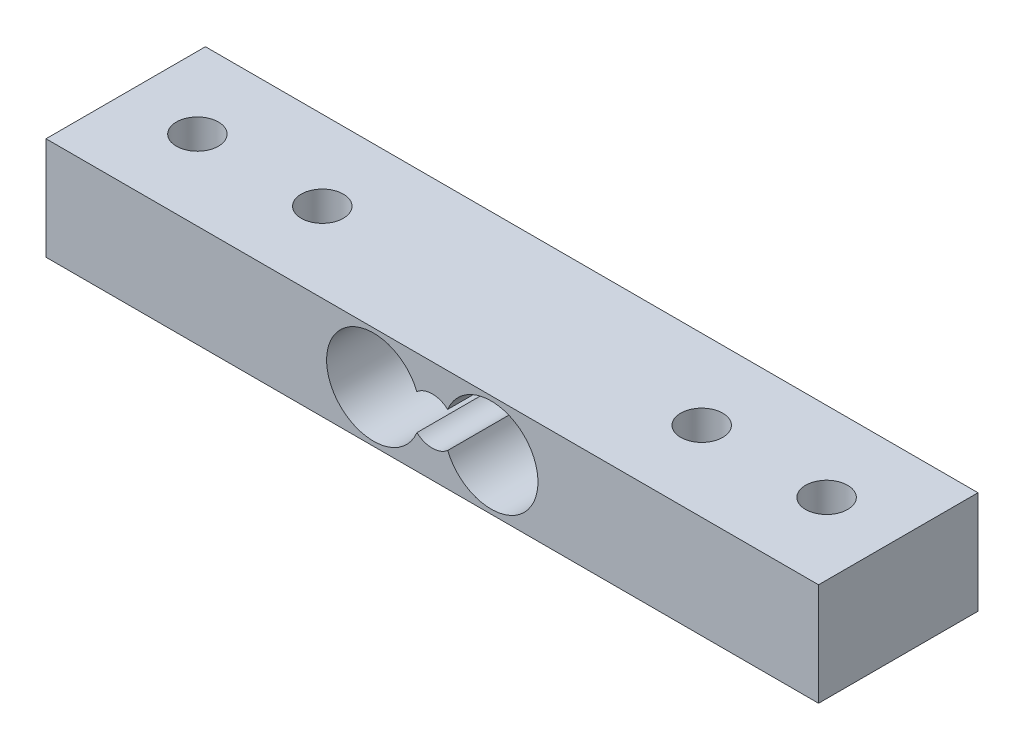
ISO-10303-21;
HEADER;
FILE_DESCRIPTION(('STEP AP214'),'2;1');
FILE_NAME('part.step','',(''),(''),'','','');
FILE_SCHEMA(('AUTOMOTIVE_DESIGN { 1 0 10303 214 1 1 1 1 }'));
ENDSEC;
DATA;
#1=APPLICATION_CONTEXT('core data for automotive mechanical design processes');
#2=APPLICATION_PROTOCOL_DEFINITION('international standard','automotive_design',2000,#1);
#3=PRODUCT_CONTEXT('',#1,'mechanical');
#4=PRODUCT('Part','Part','',(#3));
#5=PRODUCT_RELATED_PRODUCT_CATEGORY('part','',(#4));
#6=PRODUCT_DEFINITION_FORMATION('','',#4);
#7=PRODUCT_DEFINITION_CONTEXT('part definition',#1,'design');
#8=PRODUCT_DEFINITION('design','',#6,#7);
#9=PRODUCT_DEFINITION_SHAPE('','',#8);
#10=(LENGTH_UNIT() NAMED_UNIT(*) SI_UNIT(.MILLI.,.METRE.));
#11=(NAMED_UNIT(*) PLANE_ANGLE_UNIT() SI_UNIT($,.RADIAN.));
#12=(NAMED_UNIT(*) SI_UNIT($,.STERADIAN.) SOLID_ANGLE_UNIT());
#13=UNCERTAINTY_MEASURE_WITH_UNIT(LENGTH_MEASURE(1.E-05),#10,'distance_accuracy_value','');
#14=(GEOMETRIC_REPRESENTATION_CONTEXT(3) GLOBAL_UNCERTAINTY_ASSIGNED_CONTEXT((#13)) GLOBAL_UNIT_ASSIGNED_CONTEXT((#10,
#11,#12)) REPRESENTATION_CONTEXT('',''));
#15=CARTESIAN_POINT('',(0.,0.,0.));
#16=DIRECTION('',(0.,0.,1.));
#17=DIRECTION('',(1.,0.,0.));
#18=AXIS2_PLACEMENT_3D('',#15,#16,#17);
#19=CARTESIAN_POINT('',(-22.58,3.,0.));
#20=DIRECTION('',(0.,0.,1.));
#21=DIRECTION('',(1.,0.,0.));
#22=AXIS2_PLACEMENT_3D('',#19,#20,#21);
#23=CYLINDRICAL_SURFACE('',#22,1.375);
#24=DIRECTION('',(0.,0.,1.));
#25=VECTOR('',#24,1.);
#26=CARTESIAN_POINT('',(-23.4811084663068,4.03857042705353,0.));
#27=LINE('',#26,#25);
#28=CARTESIAN_POINT('',(-23.4811084663068,4.03857042705354,9.32));
#29=VERTEX_POINT('',#28);
#30=CARTESIAN_POINT('',(-23.4811084663068,4.03857042705354,0.));
#31=VERTEX_POINT('',#30);
#32=EDGE_CURVE('E94',#29,#31,#27,.F.);
#33=ORIENTED_EDGE('',*,*,#32,.T.);
#34=CARTESIAN_POINT('',(-22.58,3.,0.));
#35=DIRECTION('',(0.,0.,1.));
#36=DIRECTION('',(1.,0.,0.));
#37=AXIS2_PLACEMENT_3D('',#34,#35,#36);
#38=CIRCLE('',#37,1.375);
#39=CARTESIAN_POINT('',(-21.6788915336932,4.03857042705354,0.));
#40=VERTEX_POINT('',#39);
#41=EDGE_CURVE('E148',#31,#40,#38,.F.);
#42=ORIENTED_EDGE('',*,*,#41,.T.);
#43=DIRECTION('',(0.,0.,1.));
#44=VECTOR('',#43,1.);
#45=CARTESIAN_POINT('',(-21.6788915336932,4.03857042705353,0.));
#46=LINE('',#45,#44);
#47=CARTESIAN_POINT('',(-21.6788915336932,4.03857042705354,9.32));
#48=VERTEX_POINT('',#47);
#49=EDGE_CURVE('E154',#40,#48,#46,.T.);
#50=ORIENTED_EDGE('',*,*,#49,.T.);
#51=CARTESIAN_POINT('',(-22.58,3.,9.32));
#52=DIRECTION('',(0.,0.,1.));
#53=DIRECTION('',(1.,0.,0.));
#54=AXIS2_PLACEMENT_3D('',#51,#52,#53);
#55=CIRCLE('',#54,1.375);
#56=EDGE_CURVE('E102',#29,#48,#55,.F.);
#57=ORIENTED_EDGE('',*,*,#56,.F.);
#58=EDGE_LOOP('',(#33,#42,#50,#57));
#59=FACE_BOUND('',#58,.T.);
#60=ADVANCED_FACE('F16',(#59),#23,.F.);
#61=CARTESIAN_POINT('',(-19.143211517334,3.,0.));
#62=DIRECTION('',(0.,0.,1.));
#63=DIRECTION('',(1.,0.,0.));
#64=AXIS2_PLACEMENT_3D('',#61,#62,#63);
#65=CYLINDRICAL_SURFACE('',#64,2.74012804031372);
#66=ORIENTED_EDGE('',*,*,#49,.F.);
#67=CARTESIAN_POINT('',(-19.143211517334,3.,0.));
#68=DIRECTION('',(0.,0.,1.));
#69=DIRECTION('',(1.,0.,0.));
#70=AXIS2_PLACEMENT_3D('',#67,#68,#69);
#71=CIRCLE('',#70,2.74012804031372);
#72=CARTESIAN_POINT('',(-21.6788915336932,1.96142957294645,0.));
#73=VERTEX_POINT('',#72);
#74=EDGE_CURVE('E146',#40,#73,#71,.F.);
#75=ORIENTED_EDGE('',*,*,#74,.T.);
#76=DIRECTION('',(0.,0.,1.));
#77=VECTOR('',#76,1.);
#78=CARTESIAN_POINT('',(-21.6788915336932,1.96142957294645,0.));
#79=LINE('',#78,#77);
#80=CARTESIAN_POINT('',(-21.6788915336932,1.96142957294645,9.32));
#81=VERTEX_POINT('',#80);
#82=EDGE_CURVE('E78',#73,#81,#79,.T.);
#83=ORIENTED_EDGE('',*,*,#82,.T.);
#84=CARTESIAN_POINT('',(-19.143211517334,3.,9.32));
#85=DIRECTION('',(0.,0.,1.));
#86=DIRECTION('',(1.,0.,0.));
#87=AXIS2_PLACEMENT_3D('',#84,#85,#86);
#88=CIRCLE('',#87,2.74012804031372);
#89=EDGE_CURVE('E105',#48,#81,#88,.F.);
#90=ORIENTED_EDGE('',*,*,#89,.F.);
#91=EDGE_LOOP('',(#66,#75,#83,#90));
#92=FACE_BOUND('',#91,.T.);
#93=ADVANCED_FACE('F158',(#92),#65,.F.);
#94=CARTESIAN_POINT('',(-22.58,3.,0.));
#95=DIRECTION('',(0.,0.,1.));
#96=DIRECTION('',(1.,0.,0.));
#97=AXIS2_PLACEMENT_3D('',#94,#95,#96);
#98=CYLINDRICAL_SURFACE('',#97,1.375);
#99=ORIENTED_EDGE('',*,*,#82,.F.);
#100=CARTESIAN_POINT('',(-22.58,3.,0.));
#101=DIRECTION('',(0.,0.,1.));
#102=DIRECTION('',(1.,0.,0.));
#103=AXIS2_PLACEMENT_3D('',#100,#101,#102);
#104=CIRCLE('',#103,1.375);
#105=CARTESIAN_POINT('',(-23.4811084663068,1.96142957294646,0.));
#106=VERTEX_POINT('',#105);
#107=EDGE_CURVE('E90',#73,#106,#104,.F.);
#108=ORIENTED_EDGE('',*,*,#107,.T.);
#109=DIRECTION('',(0.,0.,1.));
#110=VECTOR('',#109,1.);
#111=CARTESIAN_POINT('',(-23.4811084663068,1.96142957294646,0.));
#112=LINE('',#111,#110);
#113=CARTESIAN_POINT('',(-23.4811084663068,1.96142957294646,9.32));
#114=VERTEX_POINT('',#113);
#115=EDGE_CURVE('E83',#106,#114,#112,.T.);
#116=ORIENTED_EDGE('',*,*,#115,.T.);
#117=CARTESIAN_POINT('',(-22.58,3.,9.32));
#118=DIRECTION('',(0.,0.,1.));
#119=DIRECTION('',(1.,0.,0.));
#120=AXIS2_PLACEMENT_3D('',#117,#118,#119);
#121=CIRCLE('',#120,1.375);
#122=EDGE_CURVE('E87',#81,#114,#121,.F.);
#123=ORIENTED_EDGE('',*,*,#122,.F.);
#124=EDGE_LOOP('',(#99,#108,#116,#123));
#125=FACE_BOUND('',#124,.T.);
#126=ADVANCED_FACE('F85',(#125),#98,.F.);
#127=CARTESIAN_POINT('',(-26.016788482666,3.,0.));
#128=DIRECTION('',(0.,0.,1.));
#129=DIRECTION('',(1.,0.,0.));
#130=AXIS2_PLACEMENT_3D('',#127,#128,#129);
#131=CYLINDRICAL_SURFACE('',#130,2.74012804031372);
#132=ORIENTED_EDGE('',*,*,#115,.F.);
#133=CARTESIAN_POINT('',(-26.016788482666,3.,0.));
#134=DIRECTION('',(0.,0.,1.));
#135=DIRECTION('',(1.,0.,0.));
#136=AXIS2_PLACEMENT_3D('',#133,#134,#135);
#137=CIRCLE('',#136,2.74012804031372);
#138=EDGE_CURVE('E142',#106,#31,#137,.F.);
#139=ORIENTED_EDGE('',*,*,#138,.T.);
#140=ORIENTED_EDGE('',*,*,#32,.F.);
#141=CARTESIAN_POINT('',(-26.016788482666,3.,9.32));
#142=DIRECTION('',(0.,0.,1.));
#143=DIRECTION('',(1.,0.,0.));
#144=AXIS2_PLACEMENT_3D('',#141,#142,#143);
#145=CIRCLE('',#144,2.74012804031372);
#146=EDGE_CURVE('E97',#114,#29,#145,.F.);
#147=ORIENTED_EDGE('',*,*,#146,.F.);
#148=EDGE_LOOP('',(#132,#139,#140,#147));
#149=FACE_BOUND('',#148,.T.);
#150=ADVANCED_FACE('F98',(#149),#131,.F.);
#151=CARTESIAN_POINT('',(-22.58,6.,0.));
#152=DIRECTION('',(0.,1.,0.));
#153=DIRECTION('',(0.,0.,1.));
#154=AXIS2_PLACEMENT_3D('',#151,#152,#153);
#155=PLANE('',#154);
#156=DIRECTION('',(1.,0.,0.));
#157=VECTOR('',#156,1.);
#158=CARTESIAN_POINT('',(-22.58,6.,0.));
#159=LINE('',#158,#157);
#160=CARTESIAN_POINT('',(0.,6.,0.));
#161=VERTEX_POINT('',#160);
#162=CARTESIAN_POINT('',(-45.16,6.,0.));
#163=VERTEX_POINT('',#162);
#164=EDGE_CURVE('E144',#161,#163,#159,.F.);
#165=ORIENTED_EDGE('',*,*,#164,.T.);
#166=DIRECTION('',(0.,0.,1.));
#167=VECTOR('',#166,1.);
#168=CARTESIAN_POINT('',(-45.16,6.,0.));
#169=LINE('',#168,#167);
#170=CARTESIAN_POINT('',(-45.16,6.,9.32));
#171=VERTEX_POINT('',#170);
#172=EDGE_CURVE('E150',#171,#163,#169,.F.);
#173=ORIENTED_EDGE('',*,*,#172,.F.);
#174=DIRECTION('',(1.,0.,0.));
#175=VECTOR('',#174,1.);
#176=CARTESIAN_POINT('',(-22.58,6.,9.32));
#177=LINE('',#176,#175);
#178=CARTESIAN_POINT('',(0.,6.,9.32));
#179=VERTEX_POINT('',#178);
#180=EDGE_CURVE('E151',#179,#171,#177,.F.);
#181=ORIENTED_EDGE('',*,*,#180,.F.);
#182=DIRECTION('',(0.,0.,-1.));
#183=VECTOR('',#182,1.);
#184=CARTESIAN_POINT('',(0.,6.,0.));
#185=LINE('',#184,#183);
#186=EDGE_CURVE('E133',#161,#179,#185,.F.);
#187=ORIENTED_EDGE('',*,*,#186,.F.);
#188=EDGE_LOOP('',(#165,#173,#181,#187));
#189=FACE_BOUND('',#188,.T.);
#190=CARTESIAN_POINT('',(-40.97,6.,4.65999999999996));
#191=DIRECTION('',(0.,-1.,0.));
#192=DIRECTION('',(0.,0.,-1.));
#193=AXIS2_PLACEMENT_3D('',#190,#191,#192);
#194=CIRCLE('',#193,1.2295);
#195=CARTESIAN_POINT('',(-40.97,6.,3.43049999999996));
#196=VERTEX_POINT('',#195);
#197=EDGE_CURVE('E106',#196,#196,#194,.T.);
#198=ORIENTED_EDGE('',*,*,#197,.T.);
#199=EDGE_LOOP('',(#198));
#200=FACE_BOUND('',#199,.T.);
#201=CARTESIAN_POINT('',(-33.67,6.,4.65999999999996));
#202=DIRECTION('',(0.,-1.,0.));
#203=DIRECTION('',(0.,0.,-1.));
#204=AXIS2_PLACEMENT_3D('',#201,#202,#203);
#205=CIRCLE('',#204,1.2295);
#206=CARTESIAN_POINT('',(-33.67,6.,3.43049999999996));
#207=VERTEX_POINT('',#206);
#208=EDGE_CURVE('E109',#207,#207,#205,.T.);
#209=ORIENTED_EDGE('',*,*,#208,.T.);
#210=EDGE_LOOP('',(#209));
#211=FACE_BOUND('',#210,.T.);
#212=CARTESIAN_POINT('',(-11.49,6.,4.65999999999996));
#213=DIRECTION('',(0.,-1.,0.));
#214=DIRECTION('',(0.,0.,-1.));
#215=AXIS2_PLACEMENT_3D('',#212,#213,#214);
#216=CIRCLE('',#215,1.2295);
#217=CARTESIAN_POINT('',(-11.49,6.,3.43049999999996));
#218=VERTEX_POINT('',#217);
#219=EDGE_CURVE('E114',#218,#218,#216,.T.);
#220=ORIENTED_EDGE('',*,*,#219,.T.);
#221=EDGE_LOOP('',(#220));
#222=FACE_BOUND('',#221,.T.);
#223=CARTESIAN_POINT('',(-4.19,6.,4.65999999999996));
#224=DIRECTION('',(0.,-1.,0.));
#225=DIRECTION('',(0.,0.,-1.));
#226=AXIS2_PLACEMENT_3D('',#223,#224,#225);
#227=CIRCLE('',#226,1.2295);
#228=CARTESIAN_POINT('',(-4.19,6.,3.43049999999996));
#229=VERTEX_POINT('',#228);
#230=EDGE_CURVE('E19',#229,#229,#227,.T.);
#231=ORIENTED_EDGE('',*,*,#230,.T.);
#232=EDGE_LOOP('',(#231));
#233=FACE_BOUND('',#232,.T.);
#234=ADVANCED_FACE('F121',(#189,#200,#211,#222,#233),#155,.T.);
#235=CARTESIAN_POINT('',(-4.19,6.,4.65999999999996));
#236=DIRECTION('',(0.,-1.,0.));
#237=DIRECTION('',(0.,0.,-1.));
#238=AXIS2_PLACEMENT_3D('',#235,#236,#237);
#239=CYLINDRICAL_SURFACE('',#238,1.2295);
#240=ORIENTED_EDGE('',*,*,#230,.F.);
#241=EDGE_LOOP('',(#240));
#242=FACE_BOUND('',#241,.T.);
#243=CARTESIAN_POINT('',(-4.19,0.,4.65999999999996));
#244=DIRECTION('',(0.,-1.,0.));
#245=DIRECTION('',(0.,0.,-1.));
#246=AXIS2_PLACEMENT_3D('',#243,#244,#245);
#247=CIRCLE('',#246,1.2295);
#248=CARTESIAN_POINT('',(-4.19,0.,3.43049999999996));
#249=VERTEX_POINT('',#248);
#250=EDGE_CURVE('E130',#249,#249,#247,.F.);
#251=ORIENTED_EDGE('',*,*,#250,.F.);
#252=EDGE_LOOP('',(#251));
#253=FACE_BOUND('',#252,.T.);
#254=ADVANCED_FACE('F123',(#242,#253),#239,.F.);
#255=CARTESIAN_POINT('',(-11.49,6.,4.65999999999996));
#256=DIRECTION('',(0.,-1.,0.));
#257=DIRECTION('',(0.,0.,-1.));
#258=AXIS2_PLACEMENT_3D('',#255,#256,#257);
#259=CYLINDRICAL_SURFACE('',#258,1.2295);
#260=ORIENTED_EDGE('',*,*,#219,.F.);
#261=EDGE_LOOP('',(#260));
#262=FACE_BOUND('',#261,.T.);
#263=CARTESIAN_POINT('',(-11.49,0.,4.65999999999996));
#264=DIRECTION('',(0.,-1.,0.));
#265=DIRECTION('',(0.,0.,-1.));
#266=AXIS2_PLACEMENT_3D('',#263,#264,#265);
#267=CIRCLE('',#266,1.2295);
#268=CARTESIAN_POINT('',(-11.49,0.,3.43049999999996));
#269=VERTEX_POINT('',#268);
#270=EDGE_CURVE('E132',#269,#269,#267,.F.);
#271=ORIENTED_EDGE('',*,*,#270,.F.);
#272=EDGE_LOOP('',(#271));
#273=FACE_BOUND('',#272,.T.);
#274=ADVANCED_FACE('F126',(#262,#273),#259,.F.);
#275=CARTESIAN_POINT('',(-33.67,6.,4.65999999999996));
#276=DIRECTION('',(0.,-1.,0.));
#277=DIRECTION('',(0.,0.,-1.));
#278=AXIS2_PLACEMENT_3D('',#275,#276,#277);
#279=CYLINDRICAL_SURFACE('',#278,1.2295);
#280=ORIENTED_EDGE('',*,*,#208,.F.);
#281=EDGE_LOOP('',(#280));
#282=FACE_BOUND('',#281,.T.);
#283=CARTESIAN_POINT('',(-33.67,0.,4.65999999999996));
#284=DIRECTION('',(0.,-1.,0.));
#285=DIRECTION('',(0.,0.,-1.));
#286=AXIS2_PLACEMENT_3D('',#283,#284,#285);
#287=CIRCLE('',#286,1.2295);
#288=CARTESIAN_POINT('',(-33.67,0.,3.43049999999996));
#289=VERTEX_POINT('',#288);
#290=EDGE_CURVE('E136',#289,#289,#287,.F.);
#291=ORIENTED_EDGE('',*,*,#290,.F.);
#292=EDGE_LOOP('',(#291));
#293=FACE_BOUND('',#292,.T.);
#294=ADVANCED_FACE('F192',(#282,#293),#279,.F.);
#295=CARTESIAN_POINT('',(-40.97,6.,4.65999999999996));
#296=DIRECTION('',(0.,-1.,0.));
#297=DIRECTION('',(0.,0.,-1.));
#298=AXIS2_PLACEMENT_3D('',#295,#296,#297);
#299=CYLINDRICAL_SURFACE('',#298,1.2295);
#300=ORIENTED_EDGE('',*,*,#197,.F.);
#301=EDGE_LOOP('',(#300));
#302=FACE_BOUND('',#301,.T.);
#303=CARTESIAN_POINT('',(-40.97,0.,4.65999999999996));
#304=DIRECTION('',(0.,-1.,0.));
#305=DIRECTION('',(0.,0.,-1.));
#306=AXIS2_PLACEMENT_3D('',#303,#304,#305);
#307=CIRCLE('',#306,1.2295);
#308=CARTESIAN_POINT('',(-40.97,0.,3.43049999999996));
#309=VERTEX_POINT('',#308);
#310=EDGE_CURVE('E302',#309,#309,#307,.F.);
#311=ORIENTED_EDGE('',*,*,#310,.F.);
#312=EDGE_LOOP('',(#311));
#313=FACE_BOUND('',#312,.T.);
#314=ADVANCED_FACE('F188',(#302,#313),#299,.F.);
#315=CARTESIAN_POINT('',(-22.58,3.,9.32));
#316=DIRECTION('',(0.,0.,1.));
#317=DIRECTION('',(1.,0.,0.));
#318=AXIS2_PLACEMENT_3D('',#315,#316,#317);
#319=PLANE('',#318);
#320=ORIENTED_EDGE('',*,*,#180,.T.);
#321=DIRECTION('',(0.,1.,0.));
#322=VECTOR('',#321,1.);
#323=CARTESIAN_POINT('',(-45.16,3.,9.32));
#324=LINE('',#323,#322);
#325=CARTESIAN_POINT('',(-45.16,0.,9.32));
#326=VERTEX_POINT('',#325);
#327=EDGE_CURVE('E310',#326,#171,#324,.T.);
#328=ORIENTED_EDGE('',*,*,#327,.F.);
#329=DIRECTION('',(1.,0.,0.));
#330=VECTOR('',#329,1.);
#331=CARTESIAN_POINT('',(-22.58,0.,9.32));
#332=LINE('',#331,#330);
#333=CARTESIAN_POINT('',(0.,0.,9.32));
#334=VERTEX_POINT('',#333);
#335=EDGE_CURVE('E304',#334,#326,#332,.F.);
#336=ORIENTED_EDGE('',*,*,#335,.F.);
#337=DIRECTION('',(0.,1.,0.));
#338=VECTOR('',#337,1.);
#339=CARTESIAN_POINT('',(0.,3.,9.32));
#340=LINE('',#339,#338);
#341=EDGE_CURVE('E317',#179,#334,#340,.F.);
#342=ORIENTED_EDGE('',*,*,#341,.F.);
#343=EDGE_LOOP('',(#320,#328,#336,#342));
#344=FACE_BOUND('',#343,.T.);
#345=ORIENTED_EDGE('',*,*,#56,.T.);
#346=ORIENTED_EDGE('',*,*,#89,.T.);
#347=ORIENTED_EDGE('',*,*,#122,.T.);
#348=ORIENTED_EDGE('',*,*,#146,.T.);
#349=EDGE_LOOP('',(#345,#346,#347,#348));
#350=FACE_BOUND('',#349,.T.);
#351=ADVANCED_FACE('F104',(#344,#350),#319,.T.);
#352=CARTESIAN_POINT('',(-45.16,3.,0.));
#353=DIRECTION('',(-1.,0.,0.));
#354=DIRECTION('',(0.,0.,1.));
#355=AXIS2_PLACEMENT_3D('',#352,#353,#354);
#356=PLANE('',#355);
#357=DIRECTION('',(0.,1.,0.));
#358=VECTOR('',#357,1.);
#359=CARTESIAN_POINT('',(-45.16,3.,0.));
#360=LINE('',#359,#358);
#361=CARTESIAN_POINT('',(-45.16,0.,0.));
#362=VERTEX_POINT('',#361);
#363=EDGE_CURVE('E315',#163,#362,#360,.F.);
#364=ORIENTED_EDGE('',*,*,#363,.T.);
#365=DIRECTION('',(0.,0.,1.));
#366=VECTOR('',#365,1.);
#367=CARTESIAN_POINT('',(-45.16,0.,0.));
#368=LINE('',#367,#366);
#369=EDGE_CURVE('E323',#326,#362,#368,.F.);
#370=ORIENTED_EDGE('',*,*,#369,.F.);
#371=ORIENTED_EDGE('',*,*,#327,.T.);
#372=ORIENTED_EDGE('',*,*,#172,.T.);
#373=EDGE_LOOP('',(#364,#370,#371,#372));
#374=FACE_BOUND('',#373,.T.);
#375=ADVANCED_FACE('F182',(#374),#356,.T.);
#376=CARTESIAN_POINT('',(-22.58,3.,0.));
#377=DIRECTION('',(0.,0.,1.));
#378=DIRECTION('',(1.,0.,0.));
#379=AXIS2_PLACEMENT_3D('',#376,#377,#378);
#380=PLANE('',#379);
#381=DIRECTION('',(1.,0.,0.));
#382=VECTOR('',#381,1.);
#383=CARTESIAN_POINT('',(-22.58,0.,0.));
#384=LINE('',#383,#382);
#385=CARTESIAN_POINT('',(0.,0.,0.));
#386=VERTEX_POINT('',#385);
#387=EDGE_CURVE('E25',#362,#386,#384,.T.);
#388=ORIENTED_EDGE('',*,*,#387,.F.);
#389=ORIENTED_EDGE('',*,*,#363,.F.);
#390=ORIENTED_EDGE('',*,*,#164,.F.);
#391=DIRECTION('',(0.,1.,0.));
#392=VECTOR('',#391,1.);
#393=CARTESIAN_POINT('',(0.,3.,0.));
#394=LINE('',#393,#392);
#395=EDGE_CURVE('E34',#386,#161,#394,.T.);
#396=ORIENTED_EDGE('',*,*,#395,.F.);
#397=EDGE_LOOP('',(#388,#389,#390,#396));
#398=FACE_BOUND('',#397,.T.);
#399=ORIENTED_EDGE('',*,*,#107,.F.);
#400=ORIENTED_EDGE('',*,*,#74,.F.);
#401=ORIENTED_EDGE('',*,*,#41,.F.);
#402=ORIENTED_EDGE('',*,*,#138,.F.);
#403=EDGE_LOOP('',(#399,#400,#401,#402));
#404=FACE_BOUND('',#403,.T.);
#405=ADVANCED_FACE('F174',(#398,#404),#380,.F.);
#406=CARTESIAN_POINT('',(0.,3.,0.));
#407=DIRECTION('',(1.,0.,0.));
#408=DIRECTION('',(0.,0.,-1.));
#409=AXIS2_PLACEMENT_3D('',#406,#407,#408);
#410=PLANE('',#409);
#411=ORIENTED_EDGE('',*,*,#395,.T.);
#412=ORIENTED_EDGE('',*,*,#186,.T.);
#413=ORIENTED_EDGE('',*,*,#341,.T.);
#414=DIRECTION('',(0.,0.,1.));
#415=VECTOR('',#414,1.);
#416=CARTESIAN_POINT('',(0.,0.,0.));
#417=LINE('',#416,#415);
#418=EDGE_CURVE('E11',#386,#334,#417,.T.);
#419=ORIENTED_EDGE('',*,*,#418,.F.);
#420=EDGE_LOOP('',(#411,#412,#413,#419));
#421=FACE_BOUND('',#420,.T.);
#422=ADVANCED_FACE('F168',(#421),#410,.T.);
#423=CARTESIAN_POINT('',(-22.58,0.,0.));
#424=DIRECTION('',(0.,-1.,0.));
#425=DIRECTION('',(1.,0.,0.));
#426=AXIS2_PLACEMENT_3D('',#423,#424,#425);
#427=PLANE('',#426);
#428=ORIENTED_EDGE('',*,*,#387,.T.);
#429=ORIENTED_EDGE('',*,*,#418,.T.);
#430=ORIENTED_EDGE('',*,*,#335,.T.);
#431=ORIENTED_EDGE('',*,*,#369,.T.);
#432=EDGE_LOOP('',(#428,#429,#430,#431));
#433=FACE_BOUND('',#432,.T.);
#434=ORIENTED_EDGE('',*,*,#310,.T.);
#435=EDGE_LOOP('',(#434));
#436=FACE_BOUND('',#435,.T.);
#437=ORIENTED_EDGE('',*,*,#290,.T.);
#438=EDGE_LOOP('',(#437));
#439=FACE_BOUND('',#438,.T.);
#440=ORIENTED_EDGE('',*,*,#270,.T.);
#441=EDGE_LOOP('',(#440));
#442=FACE_BOUND('',#441,.T.);
#443=ORIENTED_EDGE('',*,*,#250,.T.);
#444=EDGE_LOOP('',(#443));
#445=FACE_BOUND('',#444,.T.);
#446=ADVANCED_FACE('F166',(#433,#436,#439,#442,#445),#427,.T.);
#447=CLOSED_SHELL('',(#60,#93,#126,#150,#234,#254,#274,#294,#314,#351,#375,#405,#422,#446));
#448=MANIFOLD_SOLID_BREP('B1',#447);
#449=ADVANCED_BREP_SHAPE_REPRESENTATION('',(#18,#448),#14);
#450=SHAPE_DEFINITION_REPRESENTATION(#9,#449);
ENDSEC;
END-ISO-10303-21;
